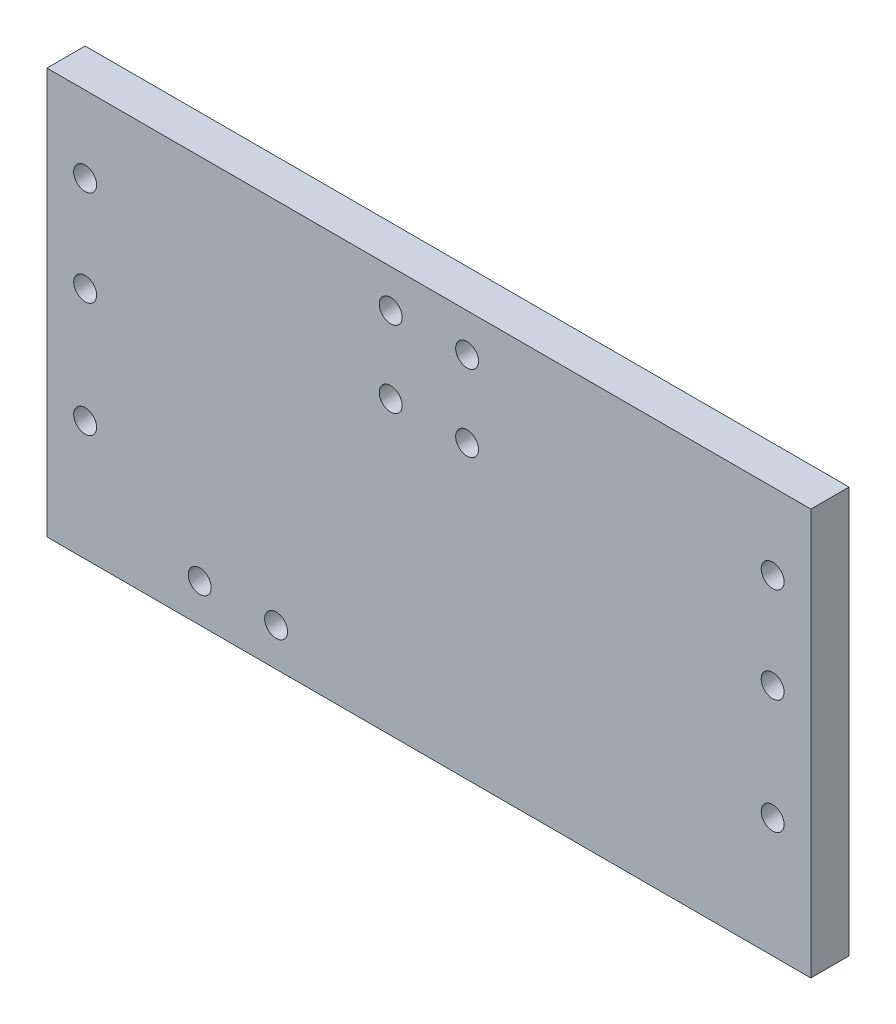
ISO-10303-21;
HEADER;
FILE_DESCRIPTION(('STEP AP214'),'2;1');
FILE_NAME('part.step','',(''),(''),'','','');
FILE_SCHEMA(('AUTOMOTIVE_DESIGN { 1 0 10303 214 1 1 1 1 }'));
ENDSEC;
DATA;
#1=APPLICATION_CONTEXT('core data for automotive mechanical design processes');
#2=APPLICATION_PROTOCOL_DEFINITION('international standard','automotive_design',2000,#1);
#3=PRODUCT_CONTEXT('',#1,'mechanical');
#4=PRODUCT('Part','Part','',(#3));
#5=PRODUCT_RELATED_PRODUCT_CATEGORY('part','',(#4));
#6=PRODUCT_DEFINITION_FORMATION('','',#4);
#7=PRODUCT_DEFINITION_CONTEXT('part definition',#1,'design');
#8=PRODUCT_DEFINITION('design','',#6,#7);
#9=PRODUCT_DEFINITION_SHAPE('','',#8);
#10=(LENGTH_UNIT() NAMED_UNIT(*) SI_UNIT(.MILLI.,.METRE.));
#11=(NAMED_UNIT(*) PLANE_ANGLE_UNIT() SI_UNIT($,.RADIAN.));
#12=(NAMED_UNIT(*) SI_UNIT($,.STERADIAN.) SOLID_ANGLE_UNIT());
#13=UNCERTAINTY_MEASURE_WITH_UNIT(LENGTH_MEASURE(1.E-05),#10,'distance_accuracy_value','');
#14=(GEOMETRIC_REPRESENTATION_CONTEXT(3) GLOBAL_UNCERTAINTY_ASSIGNED_CONTEXT((#13)) GLOBAL_UNIT_ASSIGNED_CONTEXT((#10,
#11,#12)) REPRESENTATION_CONTEXT('',''));
#15=CARTESIAN_POINT('',(0.,0.,0.));
#16=DIRECTION('',(0.,0.,1.));
#17=DIRECTION('',(1.,0.,0.));
#18=AXIS2_PLACEMENT_3D('',#15,#16,#17);
#19=CARTESIAN_POINT('',(50.,-26.58,5.));
#20=DIRECTION('',(-1.,0.,0.));
#21=DIRECTION('',(0.,0.,1.));
#22=AXIS2_PLACEMENT_3D('',#19,#20,#21);
#23=PLANE('',#22);
#24=DIRECTION('',(0.,1.,0.));
#25=VECTOR('',#24,1.);
#26=CARTESIAN_POINT('',(50.,-26.58,0.));
#27=LINE('',#26,#25);
#28=CARTESIAN_POINT('',(50.,-26.58,0.));
#29=VERTEX_POINT('',#28);
#30=CARTESIAN_POINT('',(50.,26.58,0.));
#31=VERTEX_POINT('',#30);
#32=EDGE_CURVE('E96',#29,#31,#27,.T.);
#33=ORIENTED_EDGE('',*,*,#32,.T.);
#34=DIRECTION('',(0.,0.,-1.));
#35=VECTOR('',#34,1.);
#36=CARTESIAN_POINT('',(50.,26.58,5.));
#37=LINE('',#36,#35);
#38=CARTESIAN_POINT('',(50.,26.58,5.));
#39=VERTEX_POINT('',#38);
#40=EDGE_CURVE('E11',#39,#31,#37,.T.);
#41=ORIENTED_EDGE('',*,*,#40,.F.);
#42=DIRECTION('',(0.,1.,0.));
#43=VECTOR('',#42,1.);
#44=CARTESIAN_POINT('',(50.,-26.58,5.));
#45=LINE('',#44,#43);
#46=CARTESIAN_POINT('',(50.,-26.58,5.));
#47=VERTEX_POINT('',#46);
#48=EDGE_CURVE('E84',#47,#39,#45,.T.);
#49=ORIENTED_EDGE('',*,*,#48,.F.);
#50=DIRECTION('',(0.,0.,-1.));
#51=VECTOR('',#50,1.);
#52=CARTESIAN_POINT('',(50.,-26.58,5.));
#53=LINE('',#52,#51);
#54=EDGE_CURVE('E92',#47,#29,#53,.T.);
#55=ORIENTED_EDGE('',*,*,#54,.T.);
#56=EDGE_LOOP('',(#33,#41,#49,#55));
#57=FACE_BOUND('',#56,.T.);
#58=ADVANCED_FACE('F33',(#57),#23,.F.);
#59=CARTESIAN_POINT('',(-50.,26.58,5.));
#60=DIRECTION('',(0.,-1.,0.));
#61=DIRECTION('',(0.,0.,-1.));
#62=AXIS2_PLACEMENT_3D('',#59,#60,#61);
#63=PLANE('',#62);
#64=DIRECTION('',(-1.,0.,0.));
#65=VECTOR('',#64,1.);
#66=CARTESIAN_POINT('',(-50.,26.58,0.));
#67=LINE('',#66,#65);
#68=CARTESIAN_POINT('',(-50.,26.58,0.));
#69=VERTEX_POINT('',#68);
#70=EDGE_CURVE('E88',#31,#69,#67,.T.);
#71=ORIENTED_EDGE('',*,*,#70,.T.);
#72=DIRECTION('',(0.,0.,-1.));
#73=VECTOR('',#72,1.);
#74=CARTESIAN_POINT('',(-50.,26.58,5.));
#75=LINE('',#74,#73);
#76=CARTESIAN_POINT('',(-50.,26.58,5.));
#77=VERTEX_POINT('',#76);
#78=EDGE_CURVE('E41',#77,#69,#75,.T.);
#79=ORIENTED_EDGE('',*,*,#78,.F.);
#80=DIRECTION('',(-1.,0.,0.));
#81=VECTOR('',#80,1.);
#82=CARTESIAN_POINT('',(-50.,26.58,5.));
#83=LINE('',#82,#81);
#84=EDGE_CURVE('E79',#39,#77,#83,.T.);
#85=ORIENTED_EDGE('',*,*,#84,.F.);
#86=ORIENTED_EDGE('',*,*,#40,.T.);
#87=EDGE_LOOP('',(#71,#79,#85,#86));
#88=FACE_BOUND('',#87,.T.);
#89=ADVANCED_FACE('F87',(#88),#63,.F.);
#90=CARTESIAN_POINT('',(-50.,-26.58,5.));
#91=DIRECTION('',(1.,0.,0.));
#92=DIRECTION('',(0.,0.,-1.));
#93=AXIS2_PLACEMENT_3D('',#90,#91,#92);
#94=PLANE('',#93);
#95=DIRECTION('',(0.,-1.,0.));
#96=VECTOR('',#95,1.);
#97=CARTESIAN_POINT('',(-50.,-26.58,0.));
#98=LINE('',#97,#96);
#99=CARTESIAN_POINT('',(-50.,-26.58,0.));
#100=VERTEX_POINT('',#99);
#101=EDGE_CURVE('E66',#69,#100,#98,.T.);
#102=ORIENTED_EDGE('',*,*,#101,.T.);
#103=DIRECTION('',(0.,0.,-1.));
#104=VECTOR('',#103,1.);
#105=CARTESIAN_POINT('',(-50.,-26.58,5.));
#106=LINE('',#105,#104);
#107=CARTESIAN_POINT('',(-50.,-26.58,5.));
#108=VERTEX_POINT('',#107);
#109=EDGE_CURVE('E89',#108,#100,#106,.T.);
#110=ORIENTED_EDGE('',*,*,#109,.F.);
#111=DIRECTION('',(0.,-1.,0.));
#112=VECTOR('',#111,1.);
#113=CARTESIAN_POINT('',(-50.,-26.58,5.));
#114=LINE('',#113,#112);
#115=EDGE_CURVE('E82',#77,#108,#114,.T.);
#116=ORIENTED_EDGE('',*,*,#115,.F.);
#117=ORIENTED_EDGE('',*,*,#78,.T.);
#118=EDGE_LOOP('',(#102,#110,#116,#117));
#119=FACE_BOUND('',#118,.T.);
#120=ADVANCED_FACE('F90',(#119),#94,.F.);
#121=CARTESIAN_POINT('',(-50.,-26.58,5.));
#122=DIRECTION('',(0.,1.,0.));
#123=DIRECTION('',(0.,0.,1.));
#124=AXIS2_PLACEMENT_3D('',#121,#122,#123);
#125=PLANE('',#124);
#126=DIRECTION('',(1.,0.,0.));
#127=VECTOR('',#126,1.);
#128=CARTESIAN_POINT('',(-50.,-26.58,0.));
#129=LINE('',#128,#127);
#130=EDGE_CURVE('E72',#100,#29,#129,.T.);
#131=ORIENTED_EDGE('',*,*,#130,.T.);
#132=ORIENTED_EDGE('',*,*,#54,.F.);
#133=DIRECTION('',(1.,0.,0.));
#134=VECTOR('',#133,1.);
#135=CARTESIAN_POINT('',(-50.,-26.58,5.));
#136=LINE('',#135,#134);
#137=EDGE_CURVE('E49',#108,#47,#136,.T.);
#138=ORIENTED_EDGE('',*,*,#137,.F.);
#139=ORIENTED_EDGE('',*,*,#109,.T.);
#140=EDGE_LOOP('',(#131,#132,#138,#139));
#141=FACE_BOUND('',#140,.T.);
#142=ADVANCED_FACE('F104',(#141),#125,.F.);
#143=CARTESIAN_POINT('',(0.,0.,5.));
#144=DIRECTION('',(0.,0.,-1.));
#145=DIRECTION('',(-1.,0.,0.));
#146=AXIS2_PLACEMENT_3D('',#143,#144,#145);
#147=PLANE('',#146);
#148=CARTESIAN_POINT('',(-45.,4.08,5.));
#149=DIRECTION('',(0.,0.,1.));
#150=DIRECTION('',(1.,0.,0.));
#151=AXIS2_PLACEMENT_3D('',#148,#149,#150);
#152=CIRCLE('',#151,1.5);
#153=CARTESIAN_POINT('',(-43.5,4.08,5.));
#154=VERTEX_POINT('',#153);
#155=EDGE_CURVE('E159',#154,#154,#152,.T.);
#156=ORIENTED_EDGE('',*,*,#155,.F.);
#157=EDGE_LOOP('',(#156));
#158=FACE_BOUND('',#157,.T.);
#159=CARTESIAN_POINT('',(-45.,-10.92,5.));
#160=DIRECTION('',(0.,0.,1.));
#161=DIRECTION('',(1.,0.,0.));
#162=AXIS2_PLACEMENT_3D('',#159,#160,#161);
#163=CIRCLE('',#162,1.5);
#164=CARTESIAN_POINT('',(-43.5,-10.92,5.));
#165=VERTEX_POINT('',#164);
#166=EDGE_CURVE('E153',#165,#165,#163,.T.);
#167=ORIENTED_EDGE('',*,*,#166,.F.);
#168=EDGE_LOOP('',(#167));
#169=FACE_BOUND('',#168,.T.);
#170=CARTESIAN_POINT('',(45.,-10.92,5.));
#171=DIRECTION('',(0.,0.,1.));
#172=DIRECTION('',(-1.,0.,0.));
#173=AXIS2_PLACEMENT_3D('',#170,#171,#172);
#174=CIRCLE('',#173,1.5);
#175=CARTESIAN_POINT('',(43.5,-10.92,5.));
#176=VERTEX_POINT('',#175);
#177=EDGE_CURVE('E147',#176,#176,#174,.T.);
#178=ORIENTED_EDGE('',*,*,#177,.F.);
#179=EDGE_LOOP('',(#178));
#180=FACE_BOUND('',#179,.T.);
#181=CARTESIAN_POINT('',(45.,4.08,5.));
#182=DIRECTION('',(0.,0.,1.));
#183=DIRECTION('',(-1.,0.,0.));
#184=AXIS2_PLACEMENT_3D('',#181,#182,#183);
#185=CIRCLE('',#184,1.5);
#186=CARTESIAN_POINT('',(43.5,4.08,5.));
#187=VERTEX_POINT('',#186);
#188=EDGE_CURVE('E141',#187,#187,#185,.T.);
#189=ORIENTED_EDGE('',*,*,#188,.F.);
#190=EDGE_LOOP('',(#189));
#191=FACE_BOUND('',#190,.T.);
#192=CARTESIAN_POINT('',(-5.,21.58,5.));
#193=DIRECTION('',(0.,0.,1.));
#194=DIRECTION('',(1.,0.,0.));
#195=AXIS2_PLACEMENT_3D('',#192,#193,#194);
#196=CIRCLE('',#195,1.5);
#197=CARTESIAN_POINT('',(-3.5,21.58,5.));
#198=VERTEX_POINT('',#197);
#199=EDGE_CURVE('E135',#198,#198,#196,.T.);
#200=ORIENTED_EDGE('',*,*,#199,.F.);
#201=EDGE_LOOP('',(#200));
#202=FACE_BOUND('',#201,.T.);
#203=CARTESIAN_POINT('',(45.,16.58,5.));
#204=DIRECTION('',(0.,0.,1.));
#205=DIRECTION('',(-1.,0.,0.));
#206=AXIS2_PLACEMENT_3D('',#203,#204,#205);
#207=CIRCLE('',#206,1.5);
#208=CARTESIAN_POINT('',(43.5,16.58,5.));
#209=VERTEX_POINT('',#208);
#210=EDGE_CURVE('E129',#209,#209,#207,.T.);
#211=ORIENTED_EDGE('',*,*,#210,.F.);
#212=EDGE_LOOP('',(#211));
#213=FACE_BOUND('',#212,.T.);
#214=CARTESIAN_POINT('',(-5.,11.58,5.));
#215=DIRECTION('',(0.,0.,1.));
#216=DIRECTION('',(1.,0.,0.));
#217=AXIS2_PLACEMENT_3D('',#214,#215,#216);
#218=CIRCLE('',#217,1.5);
#219=CARTESIAN_POINT('',(-3.5,11.58,5.));
#220=VERTEX_POINT('',#219);
#221=EDGE_CURVE('E123',#220,#220,#218,.T.);
#222=ORIENTED_EDGE('',*,*,#221,.F.);
#223=EDGE_LOOP('',(#222));
#224=FACE_BOUND('',#223,.T.);
#225=CARTESIAN_POINT('',(5.,11.58,5.));
#226=DIRECTION('',(0.,0.,1.));
#227=DIRECTION('',(-1.,0.,0.));
#228=AXIS2_PLACEMENT_3D('',#225,#226,#227);
#229=CIRCLE('',#228,1.5);
#230=CARTESIAN_POINT('',(3.5,11.58,5.));
#231=VERTEX_POINT('',#230);
#232=EDGE_CURVE('E116',#231,#231,#229,.T.);
#233=ORIENTED_EDGE('',*,*,#232,.F.);
#234=EDGE_LOOP('',(#233));
#235=FACE_BOUND('',#234,.T.);
#236=CARTESIAN_POINT('',(-20.,-21.58,5.));
#237=DIRECTION('',(0.,0.,1.));
#238=DIRECTION('',(1.,0.,0.));
#239=AXIS2_PLACEMENT_3D('',#236,#237,#238);
#240=CIRCLE('',#239,1.5);
#241=CARTESIAN_POINT('',(-18.5,-21.58,5.));
#242=VERTEX_POINT('',#241);
#243=EDGE_CURVE('E176',#242,#242,#240,.T.);
#244=ORIENTED_EDGE('',*,*,#243,.F.);
#245=EDGE_LOOP('',(#244));
#246=FACE_BOUND('',#245,.T.);
#247=CARTESIAN_POINT('',(-30.,-21.58,5.));
#248=DIRECTION('',(0.,0.,1.));
#249=DIRECTION('',(1.,0.,0.));
#250=AXIS2_PLACEMENT_3D('',#247,#248,#249);
#251=CIRCLE('',#250,1.5);
#252=CARTESIAN_POINT('',(-28.5,-21.58,5.));
#253=VERTEX_POINT('',#252);
#254=EDGE_CURVE('E164',#253,#253,#251,.T.);
#255=ORIENTED_EDGE('',*,*,#254,.F.);
#256=EDGE_LOOP('',(#255));
#257=FACE_BOUND('',#256,.T.);
#258=CARTESIAN_POINT('',(5.,21.58,5.));
#259=DIRECTION('',(0.,0.,1.));
#260=DIRECTION('',(-1.,0.,0.));
#261=AXIS2_PLACEMENT_3D('',#258,#259,#260);
#262=CIRCLE('',#261,1.5);
#263=CARTESIAN_POINT('',(3.5,21.58,5.));
#264=VERTEX_POINT('',#263);
#265=EDGE_CURVE('E171',#264,#264,#262,.T.);
#266=ORIENTED_EDGE('',*,*,#265,.F.);
#267=EDGE_LOOP('',(#266));
#268=FACE_BOUND('',#267,.T.);
#269=CARTESIAN_POINT('',(-45.,16.58,5.));
#270=DIRECTION('',(0.,0.,1.));
#271=DIRECTION('',(1.,0.,0.));
#272=AXIS2_PLACEMENT_3D('',#269,#270,#271);
#273=CIRCLE('',#272,1.5);
#274=CARTESIAN_POINT('',(-43.5,16.58,5.));
#275=VERTEX_POINT('',#274);
#276=EDGE_CURVE('E110',#275,#275,#273,.T.);
#277=ORIENTED_EDGE('',*,*,#276,.F.);
#278=EDGE_LOOP('',(#277));
#279=FACE_BOUND('',#278,.T.);
#280=ORIENTED_EDGE('',*,*,#48,.T.);
#281=ORIENTED_EDGE('',*,*,#84,.T.);
#282=ORIENTED_EDGE('',*,*,#115,.T.);
#283=ORIENTED_EDGE('',*,*,#137,.T.);
#284=EDGE_LOOP('',(#280,#281,#282,#283));
#285=FACE_BOUND('',#284,.T.);
#286=ADVANCED_FACE('F80',(#158,#169,#180,#191,#202,#213,#224,#235,#246,#257,#268,#279,#285),
#147,.F.);
#287=CARTESIAN_POINT('',(0.,0.,0.));
#288=DIRECTION('',(0.,0.,-1.));
#289=DIRECTION('',(-1.,0.,0.));
#290=AXIS2_PLACEMENT_3D('',#287,#288,#289);
#291=PLANE('',#290);
#292=CARTESIAN_POINT('',(-45.,4.08,0.));
#293=DIRECTION('',(0.,0.,1.));
#294=DIRECTION('',(1.,0.,0.));
#295=AXIS2_PLACEMENT_3D('',#292,#293,#294);
#296=CIRCLE('',#295,1.5);
#297=CARTESIAN_POINT('',(-43.5,4.08,0.));
#298=VERTEX_POINT('',#297);
#299=EDGE_CURVE('E113',#298,#298,#296,.T.);
#300=ORIENTED_EDGE('',*,*,#299,.T.);
#301=EDGE_LOOP('',(#300));
#302=FACE_BOUND('',#301,.T.);
#303=CARTESIAN_POINT('',(-45.,-10.92,0.));
#304=DIRECTION('',(0.,0.,1.));
#305=DIRECTION('',(1.,0.,0.));
#306=AXIS2_PLACEMENT_3D('',#303,#304,#305);
#307=CIRCLE('',#306,1.5);
#308=CARTESIAN_POINT('',(-43.5,-10.92,0.));
#309=VERTEX_POINT('',#308);
#310=EDGE_CURVE('E156',#309,#309,#307,.T.);
#311=ORIENTED_EDGE('',*,*,#310,.T.);
#312=EDGE_LOOP('',(#311));
#313=FACE_BOUND('',#312,.T.);
#314=CARTESIAN_POINT('',(45.,-10.92,0.));
#315=DIRECTION('',(0.,0.,1.));
#316=DIRECTION('',(-1.,0.,0.));
#317=AXIS2_PLACEMENT_3D('',#314,#315,#316);
#318=CIRCLE('',#317,1.5);
#319=CARTESIAN_POINT('',(43.5,-10.92,0.));
#320=VERTEX_POINT('',#319);
#321=EDGE_CURVE('E150',#320,#320,#318,.T.);
#322=ORIENTED_EDGE('',*,*,#321,.T.);
#323=EDGE_LOOP('',(#322));
#324=FACE_BOUND('',#323,.T.);
#325=CARTESIAN_POINT('',(45.,4.08,0.));
#326=DIRECTION('',(0.,0.,1.));
#327=DIRECTION('',(-1.,0.,0.));
#328=AXIS2_PLACEMENT_3D('',#325,#326,#327);
#329=CIRCLE('',#328,1.5);
#330=CARTESIAN_POINT('',(43.5,4.08,0.));
#331=VERTEX_POINT('',#330);
#332=EDGE_CURVE('E144',#331,#331,#329,.T.);
#333=ORIENTED_EDGE('',*,*,#332,.T.);
#334=EDGE_LOOP('',(#333));
#335=FACE_BOUND('',#334,.T.);
#336=CARTESIAN_POINT('',(-5.,21.58,0.));
#337=DIRECTION('',(0.,0.,1.));
#338=DIRECTION('',(1.,0.,0.));
#339=AXIS2_PLACEMENT_3D('',#336,#337,#338);
#340=CIRCLE('',#339,1.5);
#341=CARTESIAN_POINT('',(-3.5,21.58,0.));
#342=VERTEX_POINT('',#341);
#343=EDGE_CURVE('E138',#342,#342,#340,.T.);
#344=ORIENTED_EDGE('',*,*,#343,.T.);
#345=EDGE_LOOP('',(#344));
#346=FACE_BOUND('',#345,.T.);
#347=CARTESIAN_POINT('',(45.,16.58,0.));
#348=DIRECTION('',(0.,0.,1.));
#349=DIRECTION('',(-1.,0.,0.));
#350=AXIS2_PLACEMENT_3D('',#347,#348,#349);
#351=CIRCLE('',#350,1.5);
#352=CARTESIAN_POINT('',(43.5,16.58,0.));
#353=VERTEX_POINT('',#352);
#354=EDGE_CURVE('E132',#353,#353,#351,.T.);
#355=ORIENTED_EDGE('',*,*,#354,.T.);
#356=EDGE_LOOP('',(#355));
#357=FACE_BOUND('',#356,.T.);
#358=CARTESIAN_POINT('',(-5.,11.58,0.));
#359=DIRECTION('',(0.,0.,1.));
#360=DIRECTION('',(1.,0.,0.));
#361=AXIS2_PLACEMENT_3D('',#358,#359,#360);
#362=CIRCLE('',#361,1.5);
#363=CARTESIAN_POINT('',(-3.5,11.58,0.));
#364=VERTEX_POINT('',#363);
#365=EDGE_CURVE('E126',#364,#364,#362,.T.);
#366=ORIENTED_EDGE('',*,*,#365,.T.);
#367=EDGE_LOOP('',(#366));
#368=FACE_BOUND('',#367,.T.);
#369=CARTESIAN_POINT('',(5.,11.58,0.));
#370=DIRECTION('',(0.,0.,1.));
#371=DIRECTION('',(-1.,0.,0.));
#372=AXIS2_PLACEMENT_3D('',#369,#370,#371);
#373=CIRCLE('',#372,1.5);
#374=CARTESIAN_POINT('',(3.5,11.58,0.));
#375=VERTEX_POINT('',#374);
#376=EDGE_CURVE('E119',#375,#375,#373,.T.);
#377=ORIENTED_EDGE('',*,*,#376,.T.);
#378=EDGE_LOOP('',(#377));
#379=FACE_BOUND('',#378,.T.);
#380=CARTESIAN_POINT('',(-20.,-21.58,0.));
#381=DIRECTION('',(0.,0.,1.));
#382=DIRECTION('',(1.,0.,0.));
#383=AXIS2_PLACEMENT_3D('',#380,#381,#382);
#384=CIRCLE('',#383,1.5);
#385=CARTESIAN_POINT('',(-18.5,-21.58,0.));
#386=VERTEX_POINT('',#385);
#387=EDGE_CURVE('E168',#386,#386,#384,.T.);
#388=ORIENTED_EDGE('',*,*,#387,.T.);
#389=EDGE_LOOP('',(#388));
#390=FACE_BOUND('',#389,.T.);
#391=CARTESIAN_POINT('',(-30.,-21.58,0.));
#392=DIRECTION('',(0.,0.,1.));
#393=DIRECTION('',(1.,0.,0.));
#394=AXIS2_PLACEMENT_3D('',#391,#392,#393);
#395=CIRCLE('',#394,1.5);
#396=CARTESIAN_POINT('',(-28.5,-21.58,0.));
#397=VERTEX_POINT('',#396);
#398=EDGE_CURVE('E167',#397,#397,#395,.T.);
#399=ORIENTED_EDGE('',*,*,#398,.T.);
#400=EDGE_LOOP('',(#399));
#401=FACE_BOUND('',#400,.T.);
#402=CARTESIAN_POINT('',(5.,21.58,0.));
#403=DIRECTION('',(0.,0.,1.));
#404=DIRECTION('',(-1.,0.,0.));
#405=AXIS2_PLACEMENT_3D('',#402,#403,#404);
#406=CIRCLE('',#405,1.5);
#407=CARTESIAN_POINT('',(3.5,21.58,0.));
#408=VERTEX_POINT('',#407);
#409=EDGE_CURVE('E120',#408,#408,#406,.T.);
#410=ORIENTED_EDGE('',*,*,#409,.T.);
#411=EDGE_LOOP('',(#410));
#412=FACE_BOUND('',#411,.T.);
#413=CARTESIAN_POINT('',(-45.,16.58,0.));
#414=DIRECTION('',(0.,0.,1.));
#415=DIRECTION('',(1.,0.,0.));
#416=AXIS2_PLACEMENT_3D('',#413,#414,#415);
#417=CIRCLE('',#416,1.5);
#418=CARTESIAN_POINT('',(-43.5,16.58,0.));
#419=VERTEX_POINT('',#418);
#420=EDGE_CURVE('E99',#419,#419,#417,.T.);
#421=ORIENTED_EDGE('',*,*,#420,.T.);
#422=EDGE_LOOP('',(#421));
#423=FACE_BOUND('',#422,.T.);
#424=ORIENTED_EDGE('',*,*,#32,.F.);
#425=ORIENTED_EDGE('',*,*,#130,.F.);
#426=ORIENTED_EDGE('',*,*,#101,.F.);
#427=ORIENTED_EDGE('',*,*,#70,.F.);
#428=EDGE_LOOP('',(#424,#425,#426,#427));
#429=FACE_BOUND('',#428,.T.);
#430=ADVANCED_FACE('F107',(#302,#313,#324,#335,#346,#357,#368,#379,#390,#401,#412,#423,#429),
#291,.T.);
#431=CARTESIAN_POINT('',(-45.,16.58,0.));
#432=DIRECTION('',(0.,0.,1.));
#433=DIRECTION('',(1.,0.,0.));
#434=AXIS2_PLACEMENT_3D('',#431,#432,#433);
#435=CYLINDRICAL_SURFACE('',#434,1.5);
#436=ORIENTED_EDGE('',*,*,#420,.F.);
#437=EDGE_LOOP('',(#436));
#438=FACE_BOUND('',#437,.T.);
#439=ORIENTED_EDGE('',*,*,#276,.T.);
#440=EDGE_LOOP('',(#439));
#441=FACE_BOUND('',#440,.T.);
#442=ADVANCED_FACE('F202',(#438,#441),#435,.F.);
#443=CARTESIAN_POINT('',(5.,21.58,0.));
#444=DIRECTION('',(0.,0.,1.));
#445=DIRECTION('',(1.,0.,0.));
#446=AXIS2_PLACEMENT_3D('',#443,#444,#445);
#447=CYLINDRICAL_SURFACE('',#446,1.5);
#448=ORIENTED_EDGE('',*,*,#409,.F.);
#449=EDGE_LOOP('',(#448));
#450=FACE_BOUND('',#449,.T.);
#451=ORIENTED_EDGE('',*,*,#265,.T.);
#452=EDGE_LOOP('',(#451));
#453=FACE_BOUND('',#452,.T.);
#454=ADVANCED_FACE('F204',(#450,#453),#447,.F.);
#455=CARTESIAN_POINT('',(-30.,-21.58,0.));
#456=DIRECTION('',(0.,0.,1.));
#457=DIRECTION('',(1.,0.,0.));
#458=AXIS2_PLACEMENT_3D('',#455,#456,#457);
#459=CYLINDRICAL_SURFACE('',#458,1.5);
#460=ORIENTED_EDGE('',*,*,#398,.F.);
#461=EDGE_LOOP('',(#460));
#462=FACE_BOUND('',#461,.T.);
#463=ORIENTED_EDGE('',*,*,#254,.T.);
#464=EDGE_LOOP('',(#463));
#465=FACE_BOUND('',#464,.T.);
#466=ADVANCED_FACE('F188',(#462,#465),#459,.F.);
#467=CARTESIAN_POINT('',(-20.,-21.58,0.));
#468=DIRECTION('',(0.,0.,1.));
#469=DIRECTION('',(1.,0.,0.));
#470=AXIS2_PLACEMENT_3D('',#467,#468,#469);
#471=CYLINDRICAL_SURFACE('',#470,1.5);
#472=ORIENTED_EDGE('',*,*,#387,.F.);
#473=EDGE_LOOP('',(#472));
#474=FACE_BOUND('',#473,.T.);
#475=ORIENTED_EDGE('',*,*,#243,.T.);
#476=EDGE_LOOP('',(#475));
#477=FACE_BOUND('',#476,.T.);
#478=ADVANCED_FACE('F184',(#474,#477),#471,.F.);
#479=CARTESIAN_POINT('',(5.,11.58,0.));
#480=DIRECTION('',(0.,0.,1.));
#481=DIRECTION('',(1.,0.,0.));
#482=AXIS2_PLACEMENT_3D('',#479,#480,#481);
#483=CYLINDRICAL_SURFACE('',#482,1.5);
#484=ORIENTED_EDGE('',*,*,#376,.F.);
#485=EDGE_LOOP('',(#484));
#486=FACE_BOUND('',#485,.T.);
#487=ORIENTED_EDGE('',*,*,#232,.T.);
#488=EDGE_LOOP('',(#487));
#489=FACE_BOUND('',#488,.T.);
#490=ADVANCED_FACE('F187',(#486,#489),#483,.F.);
#491=CARTESIAN_POINT('',(-5.,11.58,0.));
#492=DIRECTION('',(0.,0.,1.));
#493=DIRECTION('',(1.,0.,0.));
#494=AXIS2_PLACEMENT_3D('',#491,#492,#493);
#495=CYLINDRICAL_SURFACE('',#494,1.5);
#496=ORIENTED_EDGE('',*,*,#365,.F.);
#497=EDGE_LOOP('',(#496));
#498=FACE_BOUND('',#497,.T.);
#499=ORIENTED_EDGE('',*,*,#221,.T.);
#500=EDGE_LOOP('',(#499));
#501=FACE_BOUND('',#500,.T.);
#502=ADVANCED_FACE('F273',(#498,#501),#495,.F.);
#503=CARTESIAN_POINT('',(45.,16.58,0.));
#504=DIRECTION('',(0.,0.,1.));
#505=DIRECTION('',(1.,0.,0.));
#506=AXIS2_PLACEMENT_3D('',#503,#504,#505);
#507=CYLINDRICAL_SURFACE('',#506,1.5);
#508=ORIENTED_EDGE('',*,*,#354,.F.);
#509=EDGE_LOOP('',(#508));
#510=FACE_BOUND('',#509,.T.);
#511=ORIENTED_EDGE('',*,*,#210,.T.);
#512=EDGE_LOOP('',(#511));
#513=FACE_BOUND('',#512,.T.);
#514=ADVANCED_FACE('F282',(#510,#513),#507,.F.);
#515=CARTESIAN_POINT('',(-5.,21.58,0.));
#516=DIRECTION('',(0.,0.,1.));
#517=DIRECTION('',(1.,0.,0.));
#518=AXIS2_PLACEMENT_3D('',#515,#516,#517);
#519=CYLINDRICAL_SURFACE('',#518,1.5);
#520=ORIENTED_EDGE('',*,*,#343,.F.);
#521=EDGE_LOOP('',(#520));
#522=FACE_BOUND('',#521,.T.);
#523=ORIENTED_EDGE('',*,*,#199,.T.);
#524=EDGE_LOOP('',(#523));
#525=FACE_BOUND('',#524,.T.);
#526=ADVANCED_FACE('F292',(#522,#525),#519,.F.);
#527=CARTESIAN_POINT('',(45.,4.08,0.));
#528=DIRECTION('',(0.,0.,1.));
#529=DIRECTION('',(1.,0.,0.));
#530=AXIS2_PLACEMENT_3D('',#527,#528,#529);
#531=CYLINDRICAL_SURFACE('',#530,1.5);
#532=ORIENTED_EDGE('',*,*,#332,.F.);
#533=EDGE_LOOP('',(#532));
#534=FACE_BOUND('',#533,.T.);
#535=ORIENTED_EDGE('',*,*,#188,.T.);
#536=EDGE_LOOP('',(#535));
#537=FACE_BOUND('',#536,.T.);
#538=ADVANCED_FACE('F302',(#534,#537),#531,.F.);
#539=CARTESIAN_POINT('',(45.,-10.92,0.));
#540=DIRECTION('',(0.,0.,1.));
#541=DIRECTION('',(1.,0.,0.));
#542=AXIS2_PLACEMENT_3D('',#539,#540,#541);
#543=CYLINDRICAL_SURFACE('',#542,1.5);
#544=ORIENTED_EDGE('',*,*,#321,.F.);
#545=EDGE_LOOP('',(#544));
#546=FACE_BOUND('',#545,.T.);
#547=ORIENTED_EDGE('',*,*,#177,.T.);
#548=EDGE_LOOP('',(#547));
#549=FACE_BOUND('',#548,.T.);
#550=ADVANCED_FACE('F312',(#546,#549),#543,.F.);
#551=CARTESIAN_POINT('',(-45.,-10.92,0.));
#552=DIRECTION('',(0.,0.,1.));
#553=DIRECTION('',(1.,0.,0.));
#554=AXIS2_PLACEMENT_3D('',#551,#552,#553);
#555=CYLINDRICAL_SURFACE('',#554,1.5);
#556=ORIENTED_EDGE('',*,*,#310,.F.);
#557=EDGE_LOOP('',(#556));
#558=FACE_BOUND('',#557,.T.);
#559=ORIENTED_EDGE('',*,*,#166,.T.);
#560=EDGE_LOOP('',(#559));
#561=FACE_BOUND('',#560,.T.);
#562=ADVANCED_FACE('F322',(#558,#561),#555,.F.);
#563=CARTESIAN_POINT('',(-45.,4.08,0.));
#564=DIRECTION('',(0.,0.,1.));
#565=DIRECTION('',(1.,0.,0.));
#566=AXIS2_PLACEMENT_3D('',#563,#564,#565);
#567=CYLINDRICAL_SURFACE('',#566,1.5);
#568=ORIENTED_EDGE('',*,*,#299,.F.);
#569=EDGE_LOOP('',(#568));
#570=FACE_BOUND('',#569,.T.);
#571=ORIENTED_EDGE('',*,*,#155,.T.);
#572=EDGE_LOOP('',(#571));
#573=FACE_BOUND('',#572,.T.);
#574=ADVANCED_FACE('F332',(#570,#573),#567,.F.);
#575=CLOSED_SHELL('',(#58,#89,#120,#142,#286,#430,#442,#454,#466,#478,#490,#502,#514,#526,#538,
#550,#562,#574));
#576=MANIFOLD_SOLID_BREP('B2',#575);
#577=ADVANCED_BREP_SHAPE_REPRESENTATION('',(#18,#576),#14);
#578=SHAPE_DEFINITION_REPRESENTATION(#9,#577);
ENDSEC;
END-ISO-10303-21;
